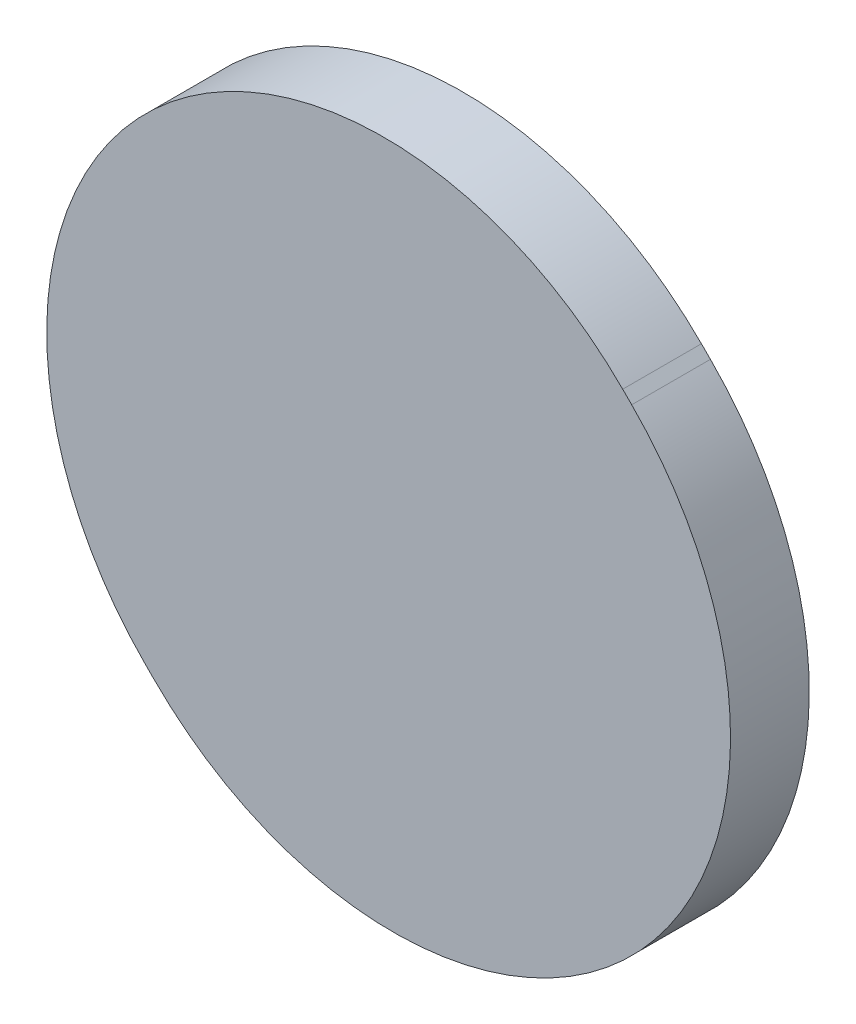
ISO-10303-21;
HEADER;
FILE_DESCRIPTION(('STEP AP214'),'2;1');
FILE_NAME('part.step','',(''),(''),'','','');
FILE_SCHEMA(('AUTOMOTIVE_DESIGN { 1 0 10303 214 1 1 1 1 }'));
ENDSEC;
DATA;
#1=APPLICATION_CONTEXT('core data for automotive mechanical design processes');
#2=APPLICATION_PROTOCOL_DEFINITION('international standard','automotive_design',2000,#1);
#3=PRODUCT_CONTEXT('',#1,'mechanical');
#4=PRODUCT('Part','Part','',(#3));
#5=PRODUCT_RELATED_PRODUCT_CATEGORY('part','',(#4));
#6=PRODUCT_DEFINITION_FORMATION('','',#4);
#7=PRODUCT_DEFINITION_CONTEXT('part definition',#1,'design');
#8=PRODUCT_DEFINITION('design','',#6,#7);
#9=PRODUCT_DEFINITION_SHAPE('','',#8);
#10=(LENGTH_UNIT() NAMED_UNIT(*) SI_UNIT(.MILLI.,.METRE.));
#11=(NAMED_UNIT(*) PLANE_ANGLE_UNIT() SI_UNIT($,.RADIAN.));
#12=(NAMED_UNIT(*) SI_UNIT($,.STERADIAN.) SOLID_ANGLE_UNIT());
#13=UNCERTAINTY_MEASURE_WITH_UNIT(LENGTH_MEASURE(1.E-05),#10,'distance_accuracy_value','');
#14=(GEOMETRIC_REPRESENTATION_CONTEXT(3) GLOBAL_UNCERTAINTY_ASSIGNED_CONTEXT((#13)) GLOBAL_UNIT_ASSIGNED_CONTEXT((#10,
#11,#12)) REPRESENTATION_CONTEXT('',''));
#15=CARTESIAN_POINT('',(0.,0.,0.));
#16=DIRECTION('',(0.,0.,1.));
#17=DIRECTION('',(1.,0.,0.));
#18=AXIS2_PLACEMENT_3D('',#15,#16,#17);
#19=CARTESIAN_POINT('',(124.360066,-116.447933,1.635));
#20=DIRECTION('',(0.,0.,1.));
#21=DIRECTION('',(1.,0.,0.));
#22=AXIS2_PLACEMENT_3D('',#19,#20,#21);
#23=PLANE('',#22);
#24=DIRECTION('',(-0.707106781186548,0.707106781186548,0.));
#25=VECTOR('',#24,1.);
#26=CARTESIAN_POINT('',(124.360066,-116.447933,1.635));
#27=LINE('',#26,#25);
#28=CARTESIAN_POINT('',(124.360066,-116.447933,1.635));
#29=VERTEX_POINT('',#28);
#30=CARTESIAN_POINT('',(124.356066,-116.443933,1.635));
#31=VERTEX_POINT('',#30);
#32=EDGE_CURVE('E81',#29,#31,#27,.T.);
#33=ORIENTED_EDGE('',*,*,#32,.T.);
#34=CARTESIAN_POINT('',(124.2499995,-116.5499995,1.635));
#35=DIRECTION('',(0.,0.,1.));
#36=DIRECTION('',(0.707106781186548,0.707106781186548,0.));
#37=AXIS2_PLACEMENT_3D('',#34,#35,#36);
#38=CIRCLE('',#37,0.150000682813);
#39=CARTESIAN_POINT('',(124.143933,-116.656066,1.635));
#40=VERTEX_POINT('',#39);
#41=EDGE_CURVE('E101',#31,#40,#38,.T.);
#42=ORIENTED_EDGE('',*,*,#41,.T.);
#43=DIRECTION('',(0.707106781185048,-0.707106781188048,0.));
#44=VECTOR('',#43,1.);
#45=CARTESIAN_POINT('',(124.143933,-116.656066,1.635));
#46=LINE('',#45,#44);
#47=CARTESIAN_POINT('',(124.147933,-116.660066,1.635));
#48=VERTEX_POINT('',#47);
#49=EDGE_CURVE('E74',#40,#48,#46,.T.);
#50=ORIENTED_EDGE('',*,*,#49,.T.);
#51=CARTESIAN_POINT('',(124.2539995,-116.5539995,1.635));
#52=DIRECTION('',(0.,0.,1.));
#53=DIRECTION('',(-0.707106781186548,-0.707106781186548,0.));
#54=AXIS2_PLACEMENT_3D('',#51,#52,#53);
#55=CIRCLE('',#54,0.150000682813);
#56=EDGE_CURVE('E11',#48,#29,#55,.T.);
#57=ORIENTED_EDGE('',*,*,#56,.T.);
#58=EDGE_LOOP('',(#33,#42,#50,#57));
#59=FACE_BOUND('',#58,.T.);
#60=ADVANCED_FACE('F17',(#59),#23,.T.);
#61=CARTESIAN_POINT('',(124.360066,-116.447933,1.6));
#62=DIRECTION('',(0.,0.,1.));
#63=DIRECTION('',(1.,0.,0.));
#64=AXIS2_PLACEMENT_3D('',#61,#62,#63);
#65=PLANE('',#64);
#66=CARTESIAN_POINT('',(124.2539995,-116.5539995,1.6));
#67=DIRECTION('',(0.,0.,1.));
#68=DIRECTION('',(-0.707106781186548,-0.707106781186548,0.));
#69=AXIS2_PLACEMENT_3D('',#66,#67,#68);
#70=CIRCLE('',#69,0.150000682813);
#71=CARTESIAN_POINT('',(124.147933,-116.660066,1.6));
#72=VERTEX_POINT('',#71);
#73=CARTESIAN_POINT('',(124.360066,-116.447933,1.6));
#74=VERTEX_POINT('',#73);
#75=EDGE_CURVE('E26',#72,#74,#70,.T.);
#76=ORIENTED_EDGE('',*,*,#75,.F.);
#77=DIRECTION('',(0.707106781185048,-0.707106781188048,0.));
#78=VECTOR('',#77,1.);
#79=CARTESIAN_POINT('',(124.143933,-116.656066,1.6));
#80=LINE('',#79,#78);
#81=CARTESIAN_POINT('',(124.143933,-116.656066,1.6));
#82=VERTEX_POINT('',#81);
#83=EDGE_CURVE('E108',#82,#72,#80,.T.);
#84=ORIENTED_EDGE('',*,*,#83,.F.);
#85=CARTESIAN_POINT('',(124.2499995,-116.5499995,1.6));
#86=DIRECTION('',(0.,0.,1.));
#87=DIRECTION('',(0.707106781186548,0.707106781186548,0.));
#88=AXIS2_PLACEMENT_3D('',#85,#86,#87);
#89=CIRCLE('',#88,0.150000682813);
#90=CARTESIAN_POINT('',(124.356066,-116.443933,1.6));
#91=VERTEX_POINT('',#90);
#92=EDGE_CURVE('E83',#91,#82,#89,.T.);
#93=ORIENTED_EDGE('',*,*,#92,.F.);
#94=DIRECTION('',(-0.707106781186548,0.707106781186548,0.));
#95=VECTOR('',#94,1.);
#96=CARTESIAN_POINT('',(124.360066,-116.447933,1.6));
#97=LINE('',#96,#95);
#98=EDGE_CURVE('E79',#74,#91,#97,.T.);
#99=ORIENTED_EDGE('',*,*,#98,.F.);
#100=EDGE_LOOP('',(#76,#84,#93,#99));
#101=FACE_BOUND('',#100,.T.);
#102=ADVANCED_FACE('F19',(#101),#65,.F.);
#103=CARTESIAN_POINT('',(124.2539995,-116.5539995,1.6));
#104=DIRECTION('',(0.,0.,-1.));
#105=DIRECTION('',(-0.707106781186548,-0.707106781186548,0.));
#106=AXIS2_PLACEMENT_3D('',#103,#104,#105);
#107=CYLINDRICAL_SURFACE('',#106,0.150000682813);
#108=ORIENTED_EDGE('',*,*,#75,.T.);
#109=DIRECTION('',(0.,0.,1.));
#110=VECTOR('',#109,1.);
#111=CARTESIAN_POINT('',(124.360066,-116.447933,1.6));
#112=LINE('',#111,#110);
#113=EDGE_CURVE('E68',#74,#29,#112,.T.);
#114=ORIENTED_EDGE('',*,*,#113,.T.);
#115=ORIENTED_EDGE('',*,*,#56,.F.);
#116=DIRECTION('',(0.,0.,1.));
#117=VECTOR('',#116,1.);
#118=CARTESIAN_POINT('',(124.147933,-116.660066,1.6));
#119=LINE('',#118,#117);
#120=EDGE_CURVE('E71',#72,#48,#119,.T.);
#121=ORIENTED_EDGE('',*,*,#120,.F.);
#122=EDGE_LOOP('',(#108,#114,#115,#121));
#123=FACE_BOUND('',#122,.T.);
#124=ADVANCED_FACE('F67',(#123),#107,.T.);
#125=CARTESIAN_POINT('',(124.143933,-116.656066,1.6));
#126=DIRECTION('',(0.707106781188048,0.707106781185048,0.));
#127=DIRECTION('',(0.,0.,-1.));
#128=AXIS2_PLACEMENT_3D('',#125,#126,#127);
#129=PLANE('',#128);
#130=ORIENTED_EDGE('',*,*,#83,.T.);
#131=ORIENTED_EDGE('',*,*,#120,.T.);
#132=ORIENTED_EDGE('',*,*,#49,.F.);
#133=DIRECTION('',(0.,0.,1.));
#134=VECTOR('',#133,1.);
#135=CARTESIAN_POINT('',(124.143933,-116.656066,1.6));
#136=LINE('',#135,#134);
#137=EDGE_CURVE('E98',#82,#40,#136,.T.);
#138=ORIENTED_EDGE('',*,*,#137,.F.);
#139=EDGE_LOOP('',(#130,#131,#132,#138));
#140=FACE_BOUND('',#139,.T.);
#141=ADVANCED_FACE('F117',(#140),#129,.F.);
#142=CARTESIAN_POINT('',(124.2499995,-116.5499995,1.6));
#143=DIRECTION('',(0.,0.,-1.));
#144=DIRECTION('',(0.707106781186548,0.707106781186548,0.));
#145=AXIS2_PLACEMENT_3D('',#142,#143,#144);
#146=CYLINDRICAL_SURFACE('',#145,0.150000682813);
#147=ORIENTED_EDGE('',*,*,#92,.T.);
#148=ORIENTED_EDGE('',*,*,#137,.T.);
#149=ORIENTED_EDGE('',*,*,#41,.F.);
#150=DIRECTION('',(0.,0.,1.));
#151=VECTOR('',#150,1.);
#152=CARTESIAN_POINT('',(124.356066,-116.443933,1.6));
#153=LINE('',#152,#151);
#154=EDGE_CURVE('E88',#91,#31,#153,.T.);
#155=ORIENTED_EDGE('',*,*,#154,.F.);
#156=EDGE_LOOP('',(#147,#148,#149,#155));
#157=FACE_BOUND('',#156,.T.);
#158=ADVANCED_FACE('F120',(#157),#146,.T.);
#159=CARTESIAN_POINT('',(124.360066,-116.447933,1.6));
#160=DIRECTION('',(-0.707106781186548,-0.707106781186548,0.));
#161=DIRECTION('',(-0.707106781186548,0.707106781186548,0.));
#162=AXIS2_PLACEMENT_3D('',#159,#160,#161);
#163=PLANE('',#162);
#164=ORIENTED_EDGE('',*,*,#98,.T.);
#165=ORIENTED_EDGE('',*,*,#154,.T.);
#166=ORIENTED_EDGE('',*,*,#32,.F.);
#167=ORIENTED_EDGE('',*,*,#113,.F.);
#168=EDGE_LOOP('',(#164,#165,#166,#167));
#169=FACE_BOUND('',#168,.T.);
#170=ADVANCED_FACE('F77',(#169),#163,.F.);
#171=CLOSED_SHELL('',(#60,#102,#124,#141,#158,#170));
#172=MANIFOLD_SOLID_BREP('B1',#171);
#173=ADVANCED_BREP_SHAPE_REPRESENTATION('',(#18,#172),#14);
#174=SHAPE_DEFINITION_REPRESENTATION(#9,#173);
ENDSEC;
END-ISO-10303-21;
